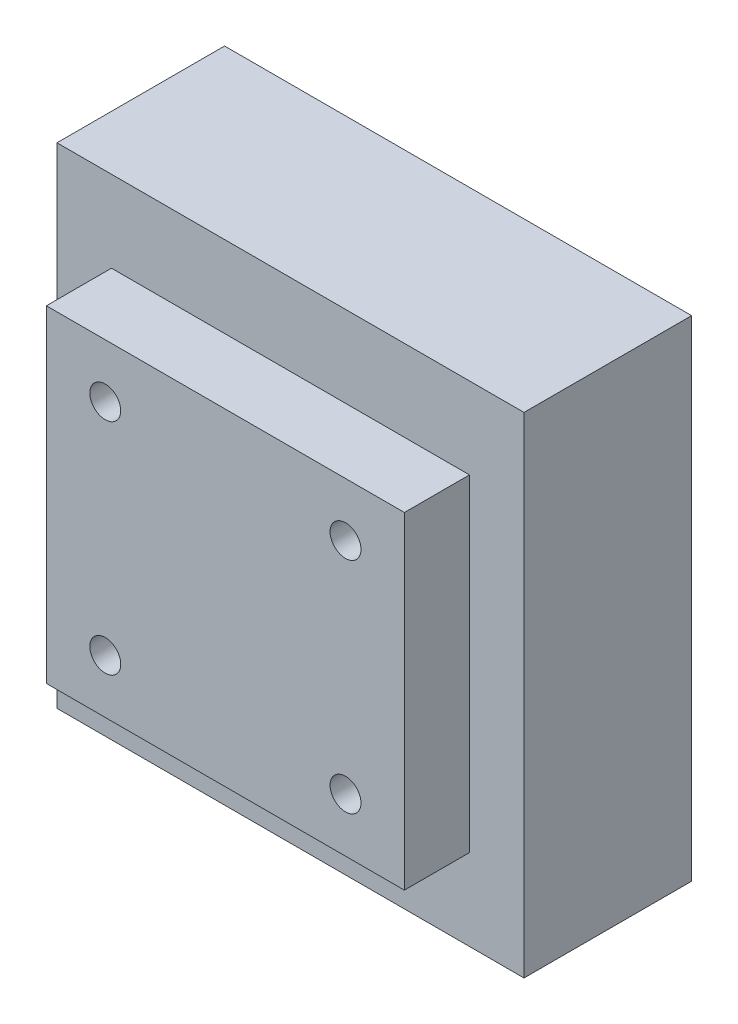
ISO-10303-21;
HEADER;
FILE_DESCRIPTION(('STEP AP214'),'2;1');
FILE_NAME('part.step','',(''),(''),'','','');
FILE_SCHEMA(('AUTOMOTIVE_DESIGN { 1 0 10303 214 1 1 1 1 }'));
ENDSEC;
DATA;
#1=APPLICATION_CONTEXT('core data for automotive mechanical design processes');
#2=APPLICATION_PROTOCOL_DEFINITION('international standard','automotive_design',2000,#1);
#3=PRODUCT_CONTEXT('',#1,'mechanical');
#4=PRODUCT('Part','Part','',(#3));
#5=PRODUCT_RELATED_PRODUCT_CATEGORY('part','',(#4));
#6=PRODUCT_DEFINITION_FORMATION('','',#4);
#7=PRODUCT_DEFINITION_CONTEXT('part definition',#1,'design');
#8=PRODUCT_DEFINITION('design','',#6,#7);
#9=PRODUCT_DEFINITION_SHAPE('','',#8);
#10=(LENGTH_UNIT() NAMED_UNIT(*) SI_UNIT(.MILLI.,.METRE.));
#11=(NAMED_UNIT(*) PLANE_ANGLE_UNIT() SI_UNIT($,.RADIAN.));
#12=(NAMED_UNIT(*) SI_UNIT($,.STERADIAN.) SOLID_ANGLE_UNIT());
#13=UNCERTAINTY_MEASURE_WITH_UNIT(LENGTH_MEASURE(1.E-05),#10,'distance_accuracy_value','');
#14=(GEOMETRIC_REPRESENTATION_CONTEXT(3) GLOBAL_UNCERTAINTY_ASSIGNED_CONTEXT((#13)) GLOBAL_UNIT_ASSIGNED_CONTEXT((#10,
#11,#12)) REPRESENTATION_CONTEXT('',''));
#15=CARTESIAN_POINT('',(0.,0.,0.));
#16=DIRECTION('',(0.,0.,1.));
#17=DIRECTION('',(1.,0.,0.));
#18=AXIS2_PLACEMENT_3D('',#15,#16,#17);
#19=CARTESIAN_POINT('',(0.,0.,10.3));
#20=DIRECTION('',(1.,0.,0.));
#21=DIRECTION('',(0.,0.,-1.));
#22=AXIS2_PLACEMENT_3D('',#19,#20,#21);
#23=PLANE('',#22);
#24=DIRECTION('',(0.,-1.,0.));
#25=VECTOR('',#24,1.);
#26=CARTESIAN_POINT('',(0.,0.,0.));
#27=LINE('',#26,#25);
#28=CARTESIAN_POINT('',(0.,30.1,0.));
#29=VERTEX_POINT('',#28);
#30=CARTESIAN_POINT('',(0.,0.,0.));
#31=VERTEX_POINT('',#30);
#32=EDGE_CURVE('E134',#29,#31,#27,.T.);
#33=ORIENTED_EDGE('',*,*,#32,.T.);
#34=DIRECTION('',(0.,0.,-1.));
#35=VECTOR('',#34,1.);
#36=CARTESIAN_POINT('',(0.,0.,10.3));
#37=LINE('',#36,#35);
#38=CARTESIAN_POINT('',(0.,0.,10.3));
#39=VERTEX_POINT('',#38);
#40=EDGE_CURVE('E11',#39,#31,#37,.T.);
#41=ORIENTED_EDGE('',*,*,#40,.F.);
#42=DIRECTION('',(0.,-1.,0.));
#43=VECTOR('',#42,1.);
#44=CARTESIAN_POINT('',(0.,0.,10.3));
#45=LINE('',#44,#43);
#46=CARTESIAN_POINT('',(0.,30.1,10.3));
#47=VERTEX_POINT('',#46);
#48=EDGE_CURVE('E145',#47,#39,#45,.T.);
#49=ORIENTED_EDGE('',*,*,#48,.F.);
#50=DIRECTION('',(0.,0.,-1.));
#51=VECTOR('',#50,1.);
#52=CARTESIAN_POINT('',(0.,30.1,10.3));
#53=LINE('',#52,#51);
#54=EDGE_CURVE('E158',#47,#29,#53,.T.);
#55=ORIENTED_EDGE('',*,*,#54,.T.);
#56=EDGE_LOOP('',(#33,#41,#49,#55));
#57=FACE_BOUND('',#56,.T.);
#58=ADVANCED_FACE('F45',(#57),#23,.F.);
#59=CARTESIAN_POINT('',(0.,0.,10.3));
#60=DIRECTION('',(0.,1.,0.));
#61=DIRECTION('',(0.,0.,1.));
#62=AXIS2_PLACEMENT_3D('',#59,#60,#61);
#63=PLANE('',#62);
#64=DIRECTION('',(1.,0.,0.));
#65=VECTOR('',#64,1.);
#66=CARTESIAN_POINT('',(0.,0.,0.));
#67=LINE('',#66,#65);
#68=CARTESIAN_POINT('',(28.7,0.,0.));
#69=VERTEX_POINT('',#68);
#70=EDGE_CURVE('E139',#31,#69,#67,.T.);
#71=ORIENTED_EDGE('',*,*,#70,.T.);
#72=DIRECTION('',(0.,0.,-1.));
#73=VECTOR('',#72,1.);
#74=CARTESIAN_POINT('',(28.7,0.,10.3));
#75=LINE('',#74,#73);
#76=CARTESIAN_POINT('',(28.7,0.,10.3));
#77=VERTEX_POINT('',#76);
#78=EDGE_CURVE('E53',#77,#69,#75,.T.);
#79=ORIENTED_EDGE('',*,*,#78,.F.);
#80=DIRECTION('',(1.,0.,0.));
#81=VECTOR('',#80,1.);
#82=CARTESIAN_POINT('',(0.,0.,10.3));
#83=LINE('',#82,#81);
#84=EDGE_CURVE('E149',#39,#77,#83,.T.);
#85=ORIENTED_EDGE('',*,*,#84,.F.);
#86=ORIENTED_EDGE('',*,*,#40,.T.);
#87=EDGE_LOOP('',(#71,#79,#85,#86));
#88=FACE_BOUND('',#87,.T.);
#89=ADVANCED_FACE('F195',(#88),#63,.F.);
#90=CARTESIAN_POINT('',(28.7,0.,10.3));
#91=DIRECTION('',(-1.,0.,0.));
#92=DIRECTION('',(0.,0.,1.));
#93=AXIS2_PLACEMENT_3D('',#90,#91,#92);
#94=PLANE('',#93);
#95=DIRECTION('',(0.,1.,0.));
#96=VECTOR('',#95,1.);
#97=CARTESIAN_POINT('',(28.7,0.,0.));
#98=LINE('',#97,#96);
#99=CARTESIAN_POINT('',(28.7,30.1,0.));
#100=VERTEX_POINT('',#99);
#101=EDGE_CURVE('E162',#69,#100,#98,.T.);
#102=ORIENTED_EDGE('',*,*,#101,.T.);
#103=DIRECTION('',(0.,0.,-1.));
#104=VECTOR('',#103,1.);
#105=CARTESIAN_POINT('',(28.7,30.1,10.3));
#106=LINE('',#105,#104);
#107=CARTESIAN_POINT('',(28.7,30.1,10.3));
#108=VERTEX_POINT('',#107);
#109=EDGE_CURVE('E170',#108,#100,#106,.T.);
#110=ORIENTED_EDGE('',*,*,#109,.F.);
#111=DIRECTION('',(0.,1.,0.));
#112=VECTOR('',#111,1.);
#113=CARTESIAN_POINT('',(28.7,0.,10.3));
#114=LINE('',#113,#112);
#115=EDGE_CURVE('E153',#77,#108,#114,.T.);
#116=ORIENTED_EDGE('',*,*,#115,.F.);
#117=ORIENTED_EDGE('',*,*,#78,.T.);
#118=EDGE_LOOP('',(#102,#110,#116,#117));
#119=FACE_BOUND('',#118,.T.);
#120=ADVANCED_FACE('F179',(#119),#94,.F.);
#121=CARTESIAN_POINT('',(0.,30.1,10.3));
#122=DIRECTION('',(0.,-1.,0.));
#123=DIRECTION('',(0.,0.,-1.));
#124=AXIS2_PLACEMENT_3D('',#121,#122,#123);
#125=PLANE('',#124);
#126=DIRECTION('',(-1.,0.,0.));
#127=VECTOR('',#126,1.);
#128=CARTESIAN_POINT('',(0.,30.1,0.));
#129=LINE('',#128,#127);
#130=EDGE_CURVE('E150',#100,#29,#129,.T.);
#131=ORIENTED_EDGE('',*,*,#130,.T.);
#132=ORIENTED_EDGE('',*,*,#54,.F.);
#133=DIRECTION('',(-1.,0.,0.));
#134=VECTOR('',#133,1.);
#135=CARTESIAN_POINT('',(0.,30.1,10.3));
#136=LINE('',#135,#134);
#137=EDGE_CURVE('E156',#108,#47,#136,.T.);
#138=ORIENTED_EDGE('',*,*,#137,.F.);
#139=ORIENTED_EDGE('',*,*,#109,.T.);
#140=EDGE_LOOP('',(#131,#132,#138,#139));
#141=FACE_BOUND('',#140,.T.);
#142=ADVANCED_FACE('F188',(#141),#125,.F.);
#143=CARTESIAN_POINT('',(0.,0.,10.3));
#144=DIRECTION('',(0.,0.,-1.));
#145=DIRECTION('',(-1.,0.,0.));
#146=AXIS2_PLACEMENT_3D('',#143,#144,#145);
#147=PLANE('',#146);
#148=DIRECTION('',(0.,-1.,0.));
#149=VECTOR('',#148,1.);
#150=CARTESIAN_POINT('',(3.35,25.1,10.3));
#151=LINE('',#150,#149);
#152=CARTESIAN_POINT('',(3.35,25.1,10.3));
#153=VERTEX_POINT('',#152);
#154=CARTESIAN_POINT('',(3.35,5.,10.3));
#155=VERTEX_POINT('',#154);
#156=EDGE_CURVE('E60',#153,#155,#151,.T.);
#157=ORIENTED_EDGE('',*,*,#156,.F.);
#158=DIRECTION('',(-1.,0.,0.));
#159=VECTOR('',#158,1.);
#160=CARTESIAN_POINT('',(25.35,25.1,10.3));
#161=LINE('',#160,#159);
#162=CARTESIAN_POINT('',(25.35,25.1,10.3));
#163=VERTEX_POINT('',#162);
#164=EDGE_CURVE('E64',#163,#153,#161,.T.);
#165=ORIENTED_EDGE('',*,*,#164,.F.);
#166=DIRECTION('',(0.,1.,0.));
#167=VECTOR('',#166,1.);
#168=CARTESIAN_POINT('',(25.35,25.1,10.3));
#169=LINE('',#168,#167);
#170=CARTESIAN_POINT('',(25.35,5.,10.3));
#171=VERTEX_POINT('',#170);
#172=EDGE_CURVE('E288',#171,#163,#169,.T.);
#173=ORIENTED_EDGE('',*,*,#172,.F.);
#174=DIRECTION('',(1.,0.,0.));
#175=VECTOR('',#174,1.);
#176=CARTESIAN_POINT('',(25.35,5.,10.3));
#177=LINE('',#176,#175);
#178=EDGE_CURVE('E285',#155,#171,#177,.T.);
#179=ORIENTED_EDGE('',*,*,#178,.F.);
#180=EDGE_LOOP('',(#157,#165,#173,#179));
#181=FACE_BOUND('',#180,.T.);
#182=ORIENTED_EDGE('',*,*,#48,.T.);
#183=ORIENTED_EDGE('',*,*,#84,.T.);
#184=ORIENTED_EDGE('',*,*,#115,.T.);
#185=ORIENTED_EDGE('',*,*,#137,.T.);
#186=EDGE_LOOP('',(#182,#183,#184,#185));
#187=FACE_BOUND('',#186,.T.);
#188=ADVANCED_FACE('F194',(#181,#187),#147,.F.);
#189=CARTESIAN_POINT('',(0.,0.,0.));
#190=DIRECTION('',(0.,0.,-1.));
#191=DIRECTION('',(-1.,0.,0.));
#192=AXIS2_PLACEMENT_3D('',#189,#190,#191);
#193=PLANE('',#192);
#194=CARTESIAN_POINT('',(6.96732496164491,8.3049196240483,0.));
#195=DIRECTION('',(0.,0.,-1.));
#196=DIRECTION('',(-1.,0.,0.));
#197=AXIS2_PLACEMENT_3D('',#194,#195,#196);
#198=CIRCLE('',#197,0.95);
#199=CARTESIAN_POINT('',(6.01732496164491,8.3049196240483,0.));
#200=VERTEX_POINT('',#199);
#201=EDGE_CURVE('E258',#200,#200,#198,.T.);
#202=ORIENTED_EDGE('',*,*,#201,.F.);
#203=EDGE_LOOP('',(#202));
#204=FACE_BOUND('',#203,.T.);
#205=CARTESIAN_POINT('',(21.7326750383551,8.3049196240483,0.));
#206=DIRECTION('',(0.,0.,-1.));
#207=DIRECTION('',(-1.,0.,0.));
#208=AXIS2_PLACEMENT_3D('',#205,#206,#207);
#209=CIRCLE('',#208,0.950000000000001);
#210=CARTESIAN_POINT('',(20.7826750383551,8.3049196240483,0.));
#211=VERTEX_POINT('',#210);
#212=EDGE_CURVE('E251',#211,#211,#209,.T.);
#213=ORIENTED_EDGE('',*,*,#212,.F.);
#214=EDGE_LOOP('',(#213));
#215=FACE_BOUND('',#214,.T.);
#216=CARTESIAN_POINT('',(21.7326750383551,21.7950803759517,0.));
#217=DIRECTION('',(0.,0.,-1.));
#218=DIRECTION('',(-1.,0.,0.));
#219=AXIS2_PLACEMENT_3D('',#216,#217,#218);
#220=CIRCLE('',#219,0.950000000000001);
#221=CARTESIAN_POINT('',(20.7826750383551,21.7950803759517,0.));
#222=VERTEX_POINT('',#221);
#223=EDGE_CURVE('E247',#222,#222,#220,.T.);
#224=ORIENTED_EDGE('',*,*,#223,.F.);
#225=EDGE_LOOP('',(#224));
#226=FACE_BOUND('',#225,.T.);
#227=CARTESIAN_POINT('',(6.96732496164491,21.7950803759517,0.));
#228=DIRECTION('',(0.,0.,-1.));
#229=DIRECTION('',(-1.,0.,0.));
#230=AXIS2_PLACEMENT_3D('',#227,#228,#229);
#231=CIRCLE('',#230,0.95);
#232=CARTESIAN_POINT('',(6.01732496164491,21.7950803759517,0.));
#233=VERTEX_POINT('',#232);
#234=EDGE_CURVE('E250',#233,#233,#231,.T.);
#235=ORIENTED_EDGE('',*,*,#234,.F.);
#236=EDGE_LOOP('',(#235));
#237=FACE_BOUND('',#236,.T.);
#238=ORIENTED_EDGE('',*,*,#32,.F.);
#239=ORIENTED_EDGE('',*,*,#130,.F.);
#240=ORIENTED_EDGE('',*,*,#101,.F.);
#241=ORIENTED_EDGE('',*,*,#70,.F.);
#242=EDGE_LOOP('',(#238,#239,#240,#241));
#243=FACE_BOUND('',#242,.T.);
#244=ADVANCED_FACE('F185',(#204,#215,#226,#237,#243),#193,.T.);
#245=CARTESIAN_POINT('',(0.,0.,14.3));
#246=DIRECTION('',(0.,0.,-1.));
#247=DIRECTION('',(-1.,0.,0.));
#248=AXIS2_PLACEMENT_3D('',#245,#246,#247);
#249=PLANE('',#248);
#250=DIRECTION('',(0.,-1.,0.));
#251=VECTOR('',#250,1.);
#252=CARTESIAN_POINT('',(3.35,25.1,14.3));
#253=LINE('',#252,#251);
#254=CARTESIAN_POINT('',(3.35,25.1,14.3));
#255=VERTEX_POINT('',#254);
#256=CARTESIAN_POINT('',(3.35,5.,14.3));
#257=VERTEX_POINT('',#256);
#258=EDGE_CURVE('E120',#255,#257,#253,.T.);
#259=ORIENTED_EDGE('',*,*,#258,.T.);
#260=DIRECTION('',(1.,0.,0.));
#261=VECTOR('',#260,1.);
#262=CARTESIAN_POINT('',(25.35,5.,14.3));
#263=LINE('',#262,#261);
#264=CARTESIAN_POINT('',(25.35,5.,14.3));
#265=VERTEX_POINT('',#264);
#266=EDGE_CURVE('E108',#257,#265,#263,.T.);
#267=ORIENTED_EDGE('',*,*,#266,.T.);
#268=DIRECTION('',(0.,1.,0.));
#269=VECTOR('',#268,1.);
#270=CARTESIAN_POINT('',(25.35,25.1,14.3));
#271=LINE('',#270,#269);
#272=CARTESIAN_POINT('',(25.35,25.1,14.3));
#273=VERTEX_POINT('',#272);
#274=EDGE_CURVE('E119',#265,#273,#271,.T.);
#275=ORIENTED_EDGE('',*,*,#274,.T.);
#276=DIRECTION('',(-1.,0.,0.));
#277=VECTOR('',#276,1.);
#278=CARTESIAN_POINT('',(25.35,25.1,14.3));
#279=LINE('',#278,#277);
#280=EDGE_CURVE('E126',#273,#255,#279,.T.);
#281=ORIENTED_EDGE('',*,*,#280,.T.);
#282=EDGE_LOOP('',(#259,#267,#275,#281));
#283=FACE_BOUND('',#282,.T.);
#284=CARTESIAN_POINT('',(6.96732496164491,8.3049196240483,14.3));
#285=DIRECTION('',(0.,0.,1.));
#286=DIRECTION('',(1.,0.,0.));
#287=AXIS2_PLACEMENT_3D('',#284,#285,#286);
#288=CIRCLE('',#287,0.95);
#289=CARTESIAN_POINT('',(7.91732496164491,8.3049196240483,14.3));
#290=VERTEX_POINT('',#289);
#291=EDGE_CURVE('E274',#290,#290,#288,.T.);
#292=ORIENTED_EDGE('',*,*,#291,.F.);
#293=EDGE_LOOP('',(#292));
#294=FACE_BOUND('',#293,.T.);
#295=CARTESIAN_POINT('',(6.96732496164491,21.7950803759517,14.3));
#296=DIRECTION('',(0.,0.,1.));
#297=DIRECTION('',(-1.,0.,0.));
#298=AXIS2_PLACEMENT_3D('',#295,#296,#297);
#299=CIRCLE('',#298,0.95);
#300=CARTESIAN_POINT('',(6.01732496164491,21.7950803759517,14.3));
#301=VERTEX_POINT('',#300);
#302=EDGE_CURVE('E270',#301,#301,#299,.T.);
#303=ORIENTED_EDGE('',*,*,#302,.F.);
#304=EDGE_LOOP('',(#303));
#305=FACE_BOUND('',#304,.T.);
#306=CARTESIAN_POINT('',(21.7326750383551,8.3049196240483,14.3));
#307=DIRECTION('',(0.,0.,1.));
#308=DIRECTION('',(-1.,0.,0.));
#309=AXIS2_PLACEMENT_3D('',#306,#307,#308);
#310=CIRCLE('',#309,0.950000000000001);
#311=CARTESIAN_POINT('',(20.7826750383551,8.3049196240483,14.3));
#312=VERTEX_POINT('',#311);
#313=EDGE_CURVE('E266',#312,#312,#310,.T.);
#314=ORIENTED_EDGE('',*,*,#313,.F.);
#315=EDGE_LOOP('',(#314));
#316=FACE_BOUND('',#315,.T.);
#317=CARTESIAN_POINT('',(21.7326750383551,21.7950803759517,14.3));
#318=DIRECTION('',(0.,0.,1.));
#319=DIRECTION('',(1.,0.,0.));
#320=AXIS2_PLACEMENT_3D('',#317,#318,#319);
#321=CIRCLE('',#320,0.950000000000001);
#322=CARTESIAN_POINT('',(22.6826750383551,21.7950803759517,14.3));
#323=VERTEX_POINT('',#322);
#324=EDGE_CURVE('E244',#323,#323,#321,.T.);
#325=ORIENTED_EDGE('',*,*,#324,.F.);
#326=EDGE_LOOP('',(#325));
#327=FACE_BOUND('',#326,.T.);
#328=ADVANCED_FACE('F123',(#283,#294,#305,#316,#327),#249,.F.);
#329=CARTESIAN_POINT('',(3.35,25.1,14.3));
#330=DIRECTION('',(1.,0.,0.));
#331=DIRECTION('',(0.,0.,-1.));
#332=AXIS2_PLACEMENT_3D('',#329,#330,#331);
#333=PLANE('',#332);
#334=ORIENTED_EDGE('',*,*,#156,.T.);
#335=DIRECTION('',(0.,0.,-1.));
#336=VECTOR('',#335,1.);
#337=CARTESIAN_POINT('',(3.35,5.,14.3));
#338=LINE('',#337,#336);
#339=EDGE_CURVE('E113',#257,#155,#338,.T.);
#340=ORIENTED_EDGE('',*,*,#339,.F.);
#341=ORIENTED_EDGE('',*,*,#258,.F.);
#342=DIRECTION('',(0.,0.,-1.));
#343=VECTOR('',#342,1.);
#344=CARTESIAN_POINT('',(3.35,25.1,14.3));
#345=LINE('',#344,#343);
#346=EDGE_CURVE('E282',#255,#153,#345,.T.);
#347=ORIENTED_EDGE('',*,*,#346,.T.);
#348=EDGE_LOOP('',(#334,#340,#341,#347));
#349=FACE_BOUND('',#348,.T.);
#350=ADVANCED_FACE('F132',(#349),#333,.F.);
#351=CARTESIAN_POINT('',(25.35,5.,14.3));
#352=DIRECTION('',(0.,1.,0.));
#353=DIRECTION('',(0.,0.,1.));
#354=AXIS2_PLACEMENT_3D('',#351,#352,#353);
#355=PLANE('',#354);
#356=ORIENTED_EDGE('',*,*,#178,.T.);
#357=DIRECTION('',(0.,0.,-1.));
#358=VECTOR('',#357,1.);
#359=CARTESIAN_POINT('',(25.35,5.,14.3));
#360=LINE('',#359,#358);
#361=EDGE_CURVE('E115',#265,#171,#360,.T.);
#362=ORIENTED_EDGE('',*,*,#361,.F.);
#363=ORIENTED_EDGE('',*,*,#266,.F.);
#364=ORIENTED_EDGE('',*,*,#339,.T.);
#365=EDGE_LOOP('',(#356,#362,#363,#364));
#366=FACE_BOUND('',#365,.T.);
#367=ADVANCED_FACE('F111',(#366),#355,.F.);
#368=CARTESIAN_POINT('',(25.35,25.1,14.3));
#369=DIRECTION('',(-1.,0.,0.));
#370=DIRECTION('',(0.,0.,1.));
#371=AXIS2_PLACEMENT_3D('',#368,#369,#370);
#372=PLANE('',#371);
#373=ORIENTED_EDGE('',*,*,#172,.T.);
#374=DIRECTION('',(0.,0.,-1.));
#375=VECTOR('',#374,1.);
#376=CARTESIAN_POINT('',(25.35,25.1,14.3));
#377=LINE('',#376,#375);
#378=EDGE_CURVE('E141',#273,#163,#377,.T.);
#379=ORIENTED_EDGE('',*,*,#378,.F.);
#380=ORIENTED_EDGE('',*,*,#274,.F.);
#381=ORIENTED_EDGE('',*,*,#361,.T.);
#382=EDGE_LOOP('',(#373,#379,#380,#381));
#383=FACE_BOUND('',#382,.T.);
#384=ADVANCED_FACE('F214',(#383),#372,.F.);
#385=CARTESIAN_POINT('',(25.35,25.1,14.3));
#386=DIRECTION('',(0.,-1.,0.));
#387=DIRECTION('',(0.,0.,-1.));
#388=AXIS2_PLACEMENT_3D('',#385,#386,#387);
#389=PLANE('',#388);
#390=ORIENTED_EDGE('',*,*,#164,.T.);
#391=ORIENTED_EDGE('',*,*,#346,.F.);
#392=ORIENTED_EDGE('',*,*,#280,.F.);
#393=ORIENTED_EDGE('',*,*,#378,.T.);
#394=EDGE_LOOP('',(#390,#391,#392,#393));
#395=FACE_BOUND('',#394,.T.);
#396=ADVANCED_FACE('F217',(#395),#389,.F.);
#397=CARTESIAN_POINT('',(6.96732496164491,8.3049196240483,14.3));
#398=DIRECTION('',(0.,0.,-1.));
#399=DIRECTION('',(-1.,0.,0.));
#400=AXIS2_PLACEMENT_3D('',#397,#398,#399);
#401=CYLINDRICAL_SURFACE('',#400,0.95);
#402=ORIENTED_EDGE('',*,*,#291,.T.);
#403=EDGE_LOOP('',(#402));
#404=FACE_BOUND('',#403,.T.);
#405=ORIENTED_EDGE('',*,*,#201,.T.);
#406=EDGE_LOOP('',(#405));
#407=FACE_BOUND('',#406,.T.);
#408=ADVANCED_FACE('F221',(#404,#407),#401,.F.);
#409=CARTESIAN_POINT('',(6.96732496164491,21.7950803759517,14.3));
#410=DIRECTION('',(0.,0.,-1.));
#411=DIRECTION('',(-1.,0.,0.));
#412=AXIS2_PLACEMENT_3D('',#409,#410,#411);
#413=CYLINDRICAL_SURFACE('',#412,0.95);
#414=ORIENTED_EDGE('',*,*,#302,.T.);
#415=EDGE_LOOP('',(#414));
#416=FACE_BOUND('',#415,.T.);
#417=ORIENTED_EDGE('',*,*,#234,.T.);
#418=EDGE_LOOP('',(#417));
#419=FACE_BOUND('',#418,.T.);
#420=ADVANCED_FACE('F227',(#416,#419),#413,.F.);
#421=CARTESIAN_POINT('',(21.7326750383551,8.3049196240483,14.3));
#422=DIRECTION('',(0.,0.,-1.));
#423=DIRECTION('',(-1.,0.,0.));
#424=AXIS2_PLACEMENT_3D('',#421,#422,#423);
#425=CYLINDRICAL_SURFACE('',#424,0.950000000000001);
#426=ORIENTED_EDGE('',*,*,#313,.T.);
#427=EDGE_LOOP('',(#426));
#428=FACE_BOUND('',#427,.T.);
#429=ORIENTED_EDGE('',*,*,#212,.T.);
#430=EDGE_LOOP('',(#429));
#431=FACE_BOUND('',#430,.T.);
#432=ADVANCED_FACE('F231',(#428,#431),#425,.F.);
#433=CARTESIAN_POINT('',(21.7326750383551,21.7950803759517,14.3));
#434=DIRECTION('',(0.,0.,-1.));
#435=DIRECTION('',(-1.,0.,0.));
#436=AXIS2_PLACEMENT_3D('',#433,#434,#435);
#437=CYLINDRICAL_SURFACE('',#436,0.950000000000001);
#438=ORIENTED_EDGE('',*,*,#324,.T.);
#439=EDGE_LOOP('',(#438));
#440=FACE_BOUND('',#439,.T.);
#441=ORIENTED_EDGE('',*,*,#223,.T.);
#442=EDGE_LOOP('',(#441));
#443=FACE_BOUND('',#442,.T.);
#444=ADVANCED_FACE('F235',(#440,#443),#437,.F.);
#445=CLOSED_SHELL('',(#58,#89,#120,#142,#188,#244,#328,#350,#367,#384,#396,#408,#420,#432,#444));
#446=MANIFOLD_SOLID_BREP('B2',#445);
#447=ADVANCED_BREP_SHAPE_REPRESENTATION('',(#18,#446),#14);
#448=SHAPE_DEFINITION_REPRESENTATION(#9,#447);
ENDSEC;
END-ISO-10303-21;
